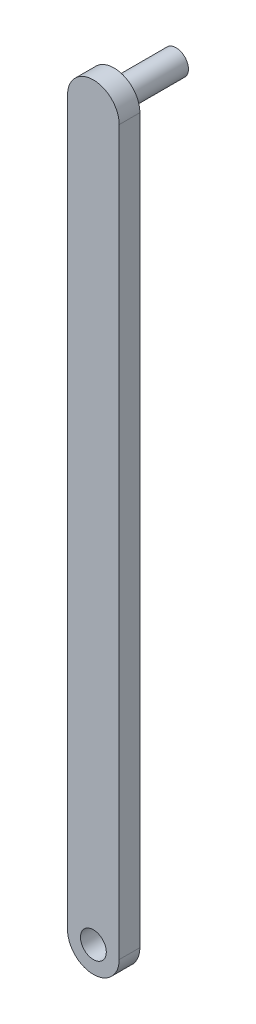
ISO-10303-21;
HEADER;
FILE_DESCRIPTION(('STEP AP214'),'2;1');
FILE_NAME('part.step','',(''),(''),'','','');
FILE_SCHEMA(('AUTOMOTIVE_DESIGN { 1 0 10303 214 1 1 1 1 }'));
ENDSEC;
DATA;
#1=APPLICATION_CONTEXT('core data for automotive mechanical design processes');
#2=APPLICATION_PROTOCOL_DEFINITION('international standard','automotive_design',2000,#1);
#3=PRODUCT_CONTEXT('',#1,'mechanical');
#4=PRODUCT('Part','Part','',(#3));
#5=PRODUCT_RELATED_PRODUCT_CATEGORY('part','',(#4));
#6=PRODUCT_DEFINITION_FORMATION('','',#4);
#7=PRODUCT_DEFINITION_CONTEXT('part definition',#1,'design');
#8=PRODUCT_DEFINITION('design','',#6,#7);
#9=PRODUCT_DEFINITION_SHAPE('','',#8);
#10=(LENGTH_UNIT() NAMED_UNIT(*) SI_UNIT(.MILLI.,.METRE.));
#11=(NAMED_UNIT(*) PLANE_ANGLE_UNIT() SI_UNIT($,.RADIAN.));
#12=(NAMED_UNIT(*) SI_UNIT($,.STERADIAN.) SOLID_ANGLE_UNIT());
#13=UNCERTAINTY_MEASURE_WITH_UNIT(LENGTH_MEASURE(1.E-05),#10,'distance_accuracy_value','');
#14=(GEOMETRIC_REPRESENTATION_CONTEXT(3) GLOBAL_UNCERTAINTY_ASSIGNED_CONTEXT((#13)) GLOBAL_UNIT_ASSIGNED_CONTEXT((#10,
#11,#12)) REPRESENTATION_CONTEXT('',''));
#15=CARTESIAN_POINT('',(0.,0.,0.));
#16=DIRECTION('',(0.,0.,1.));
#17=DIRECTION('',(1.,0.,0.));
#18=AXIS2_PLACEMENT_3D('',#15,#16,#17);
#19=CARTESIAN_POINT('',(0.,0.,-7.62));
#20=DIRECTION('',(0.,0.,1.));
#21=DIRECTION('',(1.,0.,0.));
#22=AXIS2_PLACEMENT_3D('',#19,#20,#21);
#23=CYLINDRICAL_SURFACE('',#22,1.524);
#24=CARTESIAN_POINT('',(0.,0.,-7.62));
#25=DIRECTION('',(0.,0.,1.));
#26=DIRECTION('',(1.,0.,0.));
#27=AXIS2_PLACEMENT_3D('',#24,#25,#26);
#28=CIRCLE('',#27,1.524);
#29=CARTESIAN_POINT('',(1.524,0.,-7.62));
#30=VERTEX_POINT('',#29);
#31=EDGE_CURVE('E11',#30,#30,#28,.T.);
#32=CARTESIAN_POINT('',(0.,0.,0.));
#33=DIRECTION('',(0.,0.,1.));
#34=DIRECTION('',(1.,0.,0.));
#35=AXIS2_PLACEMENT_3D('',#32,#33,#34);
#36=CIRCLE('',#35,1.524);
#37=CARTESIAN_POINT('',(1.524,0.,0.));
#38=VERTEX_POINT('',#37);
#39=EDGE_CURVE('E49',#38,#38,#36,.T.);
#40=CARTESIAN_POINT('',(1.524,0.,-7.62));
#41=CARTESIAN_POINT('',(1.524,0.,-7.540625));
#42=CARTESIAN_POINT('',(1.524,0.,-7.46125));
#43=CARTESIAN_POINT('',(1.524,0.,-7.3025));
#44=CARTESIAN_POINT('',(1.524,0.,-7.223125));
#45=CARTESIAN_POINT('',(1.524,0.,-7.064375));
#46=CARTESIAN_POINT('',(1.524,0.,-6.985));
#47=CARTESIAN_POINT('',(1.524,0.,-6.82625));
#48=CARTESIAN_POINT('',(1.524,0.,-6.746875));
#49=CARTESIAN_POINT('',(1.524,0.,-6.588125));
#50=CARTESIAN_POINT('',(1.524,0.,-6.50875));
#51=CARTESIAN_POINT('',(1.524,0.,-6.35));
#52=CARTESIAN_POINT('',(1.524,0.,-6.270625));
#53=CARTESIAN_POINT('',(1.524,0.,-6.111875));
#54=CARTESIAN_POINT('',(1.524,0.,-6.0325));
#55=CARTESIAN_POINT('',(1.524,0.,-5.87375));
#56=CARTESIAN_POINT('',(1.524,0.,-5.794375));
#57=CARTESIAN_POINT('',(1.524,0.,-5.635625));
#58=CARTESIAN_POINT('',(1.524,0.,-5.55625));
#59=CARTESIAN_POINT('',(1.524,0.,-5.3975));
#60=CARTESIAN_POINT('',(1.524,0.,-5.318125));
#61=CARTESIAN_POINT('',(1.524,0.,-5.159375));
#62=CARTESIAN_POINT('',(1.524,0.,-5.08));
#63=CARTESIAN_POINT('',(1.524,0.,-4.92125));
#64=CARTESIAN_POINT('',(1.524,0.,-4.841875));
#65=CARTESIAN_POINT('',(1.524,0.,-4.683125));
#66=CARTESIAN_POINT('',(1.524,0.,-4.60375));
#67=CARTESIAN_POINT('',(1.524,0.,-4.445));
#68=CARTESIAN_POINT('',(1.524,0.,-4.365625));
#69=CARTESIAN_POINT('',(1.524,0.,-4.206875));
#70=CARTESIAN_POINT('',(1.524,0.,-4.1275));
#71=CARTESIAN_POINT('',(1.524,0.,-3.96875));
#72=CARTESIAN_POINT('',(1.524,0.,-3.889375));
#73=CARTESIAN_POINT('',(1.524,0.,-3.730625));
#74=CARTESIAN_POINT('',(1.524,0.,-3.65125));
#75=CARTESIAN_POINT('',(1.524,0.,-3.4925));
#76=CARTESIAN_POINT('',(1.524,0.,-3.413125));
#77=CARTESIAN_POINT('',(1.524,0.,-3.254375));
#78=CARTESIAN_POINT('',(1.524,0.,-3.175));
#79=CARTESIAN_POINT('',(1.524,0.,-3.01625));
#80=CARTESIAN_POINT('',(1.524,0.,-2.936875));
#81=CARTESIAN_POINT('',(1.524,0.,-2.778125));
#82=CARTESIAN_POINT('',(1.524,0.,-2.69875));
#83=CARTESIAN_POINT('',(1.524,0.,-2.54));
#84=CARTESIAN_POINT('',(1.524,0.,-2.460625));
#85=CARTESIAN_POINT('',(1.524,0.,-2.301875));
#86=CARTESIAN_POINT('',(1.524,0.,-2.2225));
#87=CARTESIAN_POINT('',(1.524,0.,-2.06375));
#88=CARTESIAN_POINT('',(1.524,0.,-1.984375));
#89=CARTESIAN_POINT('',(1.524,0.,-1.825625));
#90=CARTESIAN_POINT('',(1.524,0.,-1.74625));
#91=CARTESIAN_POINT('',(1.524,0.,-1.5875));
#92=CARTESIAN_POINT('',(1.524,0.,-1.508125));
#93=CARTESIAN_POINT('',(1.524,0.,-1.349375));
#94=CARTESIAN_POINT('',(1.524,0.,-1.27));
#95=CARTESIAN_POINT('',(1.524,0.,-1.11125));
#96=CARTESIAN_POINT('',(1.524,0.,-1.031875));
#97=CARTESIAN_POINT('',(1.524,0.,-0.873125));
#98=CARTESIAN_POINT('',(1.524,0.,-0.79375));
#99=CARTESIAN_POINT('',(1.524,0.,-0.635));
#100=CARTESIAN_POINT('',(1.524,0.,-0.555625));
#101=CARTESIAN_POINT('',(1.524,0.,-0.396875));
#102=CARTESIAN_POINT('',(1.524,0.,-0.3175));
#103=CARTESIAN_POINT('',(1.524,0.,-0.15875));
#104=CARTESIAN_POINT('',(1.524,0.,-0.0793749999999999));
#105=CARTESIAN_POINT('',(1.524,0.,0.));
#106=B_SPLINE_CURVE_WITH_KNOTS('',3,(#40,#41,#42,#43,#44,#45,#46,#47,#48,#49,#50,#51,#52,#53,
#54,#55,#56,#57,#58,#59,#60,#61,#62,#63,#64,#65,#66,#67,#68,#69,#70,#71,#72,#73,#74,#75,#76,#77,
#78,#79,#80,#81,#82,#83,#84,#85,#86,#87,#88,#89,#90,#91,#92,#93,#94,#95,#96,#97,#98,#99,#100,
#101,#102,#103,#104,#105),.UNSPECIFIED.,.F.,.F.,(4,2,2,2,2,2,2,2,2,2,2,2,2,2,2,2,2,2,2,2,2,2,2,
2,2,2,2,2,2,2,2,2,4),(0.,0.238125,0.47625,0.714375000000001,0.9525,1.190625,1.42875,1.666875,
1.905,2.143125,2.38125,2.619375,2.8575,3.095625,3.33375,3.571875,3.81,4.048125,4.28625,4.524375,
4.7625,5.000625,5.23875,5.476875,5.715,5.953125,6.19125,6.429375,6.6675,6.905625,7.14375,
7.381875,7.62),.UNSPECIFIED.);
#107=EDGE_CURVE('BSEAM46',#30,#38,#106,.T.);
#108=ORIENTED_EDGE('',*,*,#31,.T.);
#109=ORIENTED_EDGE('',*,*,#39,.F.);
#110=ORIENTED_EDGE('',*,*,#107,.T.);
#111=ORIENTED_EDGE('',*,*,#107,.F.);
#112=EDGE_LOOP('',(#108,#110,#109,#111));
#113=FACE_BOUND('',#112,.T.);
#114=ADVANCED_FACE('F46',(#113),#23,.T.);
#115=CARTESIAN_POINT('',(0.,0.,-7.62));
#116=DIRECTION('',(0.,0.,1.));
#117=DIRECTION('',(1.,0.,0.));
#118=AXIS2_PLACEMENT_3D('',#115,#116,#117);
#119=PLANE('',#118);
#120=ORIENTED_EDGE('',*,*,#31,.F.);
#121=EDGE_LOOP('',(#120));
#122=FACE_BOUND('',#121,.T.);
#123=ADVANCED_FACE('F61',(#122),#119,.F.);
#124=CARTESIAN_POINT('',(0.,0.,0.));
#125=DIRECTION('',(0.,0.,1.));
#126=DIRECTION('',(1.,0.,0.));
#127=AXIS2_PLACEMENT_3D('',#124,#125,#126);
#128=PLANE('',#127);
#129=ORIENTED_EDGE('',*,*,#39,.T.);
#130=EDGE_LOOP('',(#129));
#131=FACE_BOUND('',#130,.T.);
#132=ADVANCED_FACE('F58',(#131),#128,.T.);
#133=CLOSED_SHELL('',(#114,#123,#132));
#134=MANIFOLD_SOLID_BREP('B2',#133);
#135=CARTESIAN_POINT('',(0.,0.,2.54));
#136=DIRECTION('',(0.,0.,1.));
#137=DIRECTION('',(1.,0.,0.));
#138=AXIS2_PLACEMENT_3D('',#135,#136,#137);
#139=PLANE('',#138);
#140=CARTESIAN_POINT('',(0.,0.,2.54));
#141=DIRECTION('',(0.,0.,1.));
#142=DIRECTION('',(1.,0.,0.));
#143=AXIS2_PLACEMENT_3D('',#140,#141,#142);
#144=CIRCLE('',#143,3.175);
#145=CARTESIAN_POINT('',(3.175,0.,2.54));
#146=VERTEX_POINT('',#145);
#147=CARTESIAN_POINT('',(-3.175,0.,2.54));
#148=VERTEX_POINT('',#147);
#149=EDGE_CURVE('E144',#146,#148,#144,.T.);
#150=ORIENTED_EDGE('',*,*,#149,.T.);
#151=DIRECTION('',(0.,-1.,0.));
#152=VECTOR('',#151,1.);
#153=CARTESIAN_POINT('',(-3.175,0.,2.54));
#154=LINE('',#153,#152);
#155=CARTESIAN_POINT('',(-3.17499999999999,-88.9,2.54));
#156=VERTEX_POINT('',#155);
#157=EDGE_CURVE('E139',#148,#156,#154,.T.);
#158=ORIENTED_EDGE('',*,*,#157,.T.);
#159=CARTESIAN_POINT('',(0.,-88.9,2.54));
#160=DIRECTION('',(0.,0.,1.));
#161=DIRECTION('',(-1.,0.,0.));
#162=AXIS2_PLACEMENT_3D('',#159,#160,#161);
#163=CIRCLE('',#162,3.17499999999999);
#164=CARTESIAN_POINT('',(3.17499999999999,-88.9,2.54));
#165=VERTEX_POINT('',#164);
#166=EDGE_CURVE('E142',#156,#165,#163,.T.);
#167=ORIENTED_EDGE('',*,*,#166,.T.);
#168=DIRECTION('',(0.,1.,0.));
#169=VECTOR('',#168,1.);
#170=CARTESIAN_POINT('',(3.175,0.,2.54));
#171=LINE('',#170,#169);
#172=EDGE_CURVE('E109',#165,#146,#171,.T.);
#173=ORIENTED_EDGE('',*,*,#172,.T.);
#174=EDGE_LOOP('',(#150,#158,#167,#173));
#175=FACE_BOUND('',#174,.T.);
#176=CARTESIAN_POINT('',(0.,-88.9,2.54));
#177=DIRECTION('',(0.,0.,1.));
#178=DIRECTION('',(1.,0.,0.));
#179=AXIS2_PLACEMENT_3D('',#176,#177,#178);
#180=CIRCLE('',#179,1.5875);
#181=CARTESIAN_POINT('',(1.5875,-88.9,2.54));
#182=VERTEX_POINT('',#181);
#183=EDGE_CURVE('E159',#182,#182,#180,.T.);
#184=ORIENTED_EDGE('',*,*,#183,.F.);
#185=EDGE_LOOP('',(#184));
#186=FACE_BOUND('',#185,.T.);
#187=ADVANCED_FACE('F92',(#175,#186),#139,.T.);
#188=CARTESIAN_POINT('',(0.,0.,0.));
#189=DIRECTION('',(0.,0.,1.));
#190=DIRECTION('',(1.,0.,0.));
#191=AXIS2_PLACEMENT_3D('',#188,#189,#190);
#192=PLANE('',#191);
#193=CARTESIAN_POINT('',(0.,0.,0.));
#194=DIRECTION('',(0.,0.,1.));
#195=DIRECTION('',(1.,0.,0.));
#196=AXIS2_PLACEMENT_3D('',#193,#194,#195);
#197=CIRCLE('',#196,3.175);
#198=CARTESIAN_POINT('',(3.175,0.,0.));
#199=VERTEX_POINT('',#198);
#200=CARTESIAN_POINT('',(-3.175,0.,0.));
#201=VERTEX_POINT('',#200);
#202=EDGE_CURVE('E156',#199,#201,#197,.T.);
#203=ORIENTED_EDGE('',*,*,#202,.F.);
#204=DIRECTION('',(0.,1.,0.));
#205=VECTOR('',#204,1.);
#206=CARTESIAN_POINT('',(3.175,0.,0.));
#207=LINE('',#206,#205);
#208=CARTESIAN_POINT('',(3.17499999999999,-88.9,0.));
#209=VERTEX_POINT('',#208);
#210=EDGE_CURVE('E132',#209,#199,#207,.T.);
#211=ORIENTED_EDGE('',*,*,#210,.F.);
#212=CARTESIAN_POINT('',(0.,-88.9,0.));
#213=DIRECTION('',(0.,0.,1.));
#214=DIRECTION('',(-1.,0.,0.));
#215=AXIS2_PLACEMENT_3D('',#212,#213,#214);
#216=CIRCLE('',#215,3.17499999999999);
#217=CARTESIAN_POINT('',(-3.17499999999999,-88.9,0.));
#218=VERTEX_POINT('',#217);
#219=EDGE_CURVE('E126',#218,#209,#216,.T.);
#220=ORIENTED_EDGE('',*,*,#219,.F.);
#221=DIRECTION('',(0.,-1.,0.));
#222=VECTOR('',#221,1.);
#223=CARTESIAN_POINT('',(-3.175,0.,0.));
#224=LINE('',#223,#222);
#225=EDGE_CURVE('E148',#201,#218,#224,.T.);
#226=ORIENTED_EDGE('',*,*,#225,.F.);
#227=EDGE_LOOP('',(#203,#211,#220,#226));
#228=FACE_BOUND('',#227,.T.);
#229=CARTESIAN_POINT('',(0.,-88.9,0.));
#230=DIRECTION('',(0.,0.,1.));
#231=DIRECTION('',(1.,0.,0.));
#232=AXIS2_PLACEMENT_3D('',#229,#230,#231);
#233=CIRCLE('',#232,1.5875);
#234=CARTESIAN_POINT('',(1.5875,-88.9,0.));
#235=VERTEX_POINT('',#234);
#236=EDGE_CURVE('E171',#235,#235,#233,.T.);
#237=ORIENTED_EDGE('',*,*,#236,.T.);
#238=EDGE_LOOP('',(#237));
#239=FACE_BOUND('',#238,.T.);
#240=ADVANCED_FACE('F167',(#228,#239),#192,.F.);
#241=CARTESIAN_POINT('',(0.,0.,2.54));
#242=DIRECTION('',(0.,0.,-1.));
#243=DIRECTION('',(-1.,0.,0.));
#244=AXIS2_PLACEMENT_3D('',#241,#242,#243);
#245=CYLINDRICAL_SURFACE('',#244,3.175);
#246=ORIENTED_EDGE('',*,*,#202,.T.);
#247=DIRECTION('',(0.,0.,-1.));
#248=VECTOR('',#247,1.);
#249=CARTESIAN_POINT('',(-3.175,0.,2.54));
#250=LINE('',#249,#248);
#251=EDGE_CURVE('E44',#148,#201,#250,.T.);
#252=ORIENTED_EDGE('',*,*,#251,.F.);
#253=ORIENTED_EDGE('',*,*,#149,.F.);
#254=DIRECTION('',(0.,0.,-1.));
#255=VECTOR('',#254,1.);
#256=CARTESIAN_POINT('',(3.175,0.,2.54));
#257=LINE('',#256,#255);
#258=EDGE_CURVE('E152',#146,#199,#257,.T.);
#259=ORIENTED_EDGE('',*,*,#258,.T.);
#260=EDGE_LOOP('',(#246,#252,#253,#259));
#261=FACE_BOUND('',#260,.T.);
#262=ADVANCED_FACE('F94',(#261),#245,.T.);
#263=CARTESIAN_POINT('',(-3.175,0.,2.54));
#264=DIRECTION('',(1.,0.,0.));
#265=DIRECTION('',(0.,1.,0.));
#266=AXIS2_PLACEMENT_3D('',#263,#264,#265);
#267=PLANE('',#266);
#268=ORIENTED_EDGE('',*,*,#225,.T.);
#269=DIRECTION('',(0.,0.,-1.));
#270=VECTOR('',#269,1.);
#271=CARTESIAN_POINT('',(-3.17499999999999,-88.9,2.54));
#272=LINE('',#271,#270);
#273=EDGE_CURVE('E101',#156,#218,#272,.T.);
#274=ORIENTED_EDGE('',*,*,#273,.F.);
#275=ORIENTED_EDGE('',*,*,#157,.F.);
#276=ORIENTED_EDGE('',*,*,#251,.T.);
#277=EDGE_LOOP('',(#268,#274,#275,#276));
#278=FACE_BOUND('',#277,.T.);
#279=ADVANCED_FACE('F147',(#278),#267,.F.);
#280=CARTESIAN_POINT('',(0.,-88.9,2.54));
#281=DIRECTION('',(0.,0.,-1.));
#282=DIRECTION('',(-1.,0.,0.));
#283=AXIS2_PLACEMENT_3D('',#280,#281,#282);
#284=CYLINDRICAL_SURFACE('',#283,3.17499999999999);
#285=ORIENTED_EDGE('',*,*,#219,.T.);
#286=DIRECTION('',(0.,0.,-1.));
#287=VECTOR('',#286,1.);
#288=CARTESIAN_POINT('',(3.17499999999999,-88.9,2.54));
#289=LINE('',#288,#287);
#290=EDGE_CURVE('E149',#165,#209,#289,.T.);
#291=ORIENTED_EDGE('',*,*,#290,.F.);
#292=ORIENTED_EDGE('',*,*,#166,.F.);
#293=ORIENTED_EDGE('',*,*,#273,.T.);
#294=EDGE_LOOP('',(#285,#291,#292,#293));
#295=FACE_BOUND('',#294,.T.);
#296=ADVANCED_FACE('F150',(#295),#284,.T.);
#297=CARTESIAN_POINT('',(3.175,0.,2.54));
#298=DIRECTION('',(-1.,0.,0.));
#299=DIRECTION('',(0.,-1.,0.));
#300=AXIS2_PLACEMENT_3D('',#297,#298,#299);
#301=PLANE('',#300);
#302=ORIENTED_EDGE('',*,*,#210,.T.);
#303=ORIENTED_EDGE('',*,*,#258,.F.);
#304=ORIENTED_EDGE('',*,*,#172,.F.);
#305=ORIENTED_EDGE('',*,*,#290,.T.);
#306=EDGE_LOOP('',(#302,#303,#304,#305));
#307=FACE_BOUND('',#306,.T.);
#308=ADVANCED_FACE('F164',(#307),#301,.F.);
#309=CARTESIAN_POINT('',(0.,-88.9,2.54));
#310=DIRECTION('',(0.,0.,-1.));
#311=DIRECTION('',(-1.,0.,0.));
#312=AXIS2_PLACEMENT_3D('',#309,#310,#311);
#313=CYLINDRICAL_SURFACE('',#312,1.5875);
#314=ORIENTED_EDGE('',*,*,#183,.T.);
#315=EDGE_LOOP('',(#314));
#316=FACE_BOUND('',#315,.T.);
#317=ORIENTED_EDGE('',*,*,#236,.F.);
#318=EDGE_LOOP('',(#317));
#319=FACE_BOUND('',#318,.T.);
#320=ADVANCED_FACE('F177',(#316,#319),#313,.F.);
#321=CLOSED_SHELL('',(#187,#240,#262,#279,#296,#308,#320));
#322=MANIFOLD_SOLID_BREP('B6',#321);
#323=ADVANCED_BREP_SHAPE_REPRESENTATION('',(#18,#134,#322),#14);
#324=SHAPE_DEFINITION_REPRESENTATION(#9,#323);
ENDSEC;
END-ISO-10303-21;
